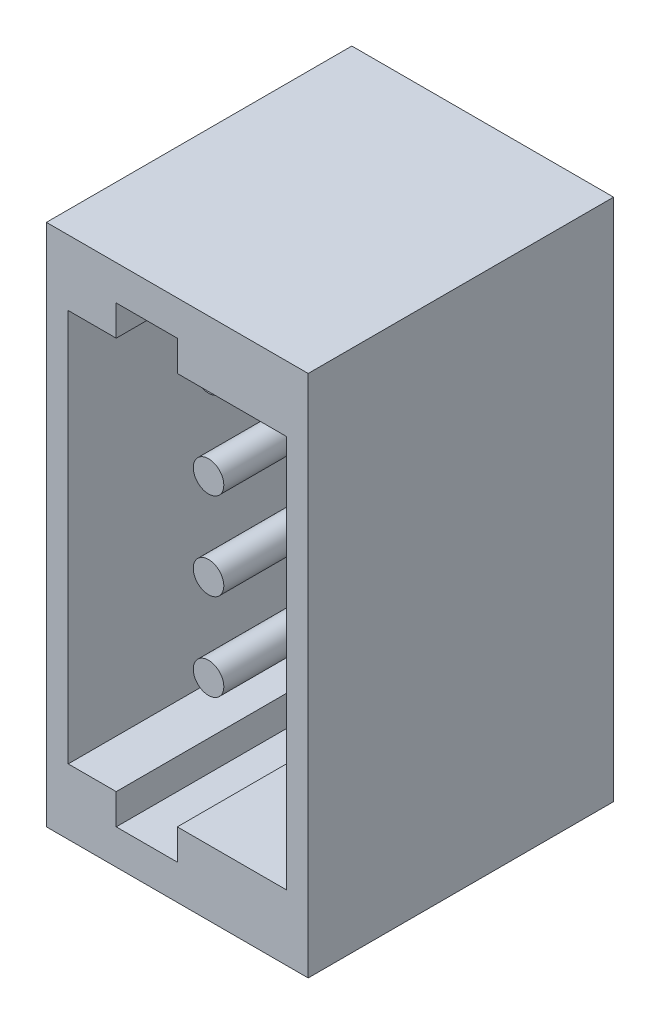
ISO-10303-21;
HEADER;
FILE_DESCRIPTION(('STEP AP214'),'2;1');
FILE_NAME('part.step','',(''),(''),'','','');
FILE_SCHEMA(('AUTOMOTIVE_DESIGN { 1 0 10303 214 1 1 1 1 }'));
ENDSEC;
DATA;
#1=APPLICATION_CONTEXT('core data for automotive mechanical design processes');
#2=APPLICATION_PROTOCOL_DEFINITION('international standard','automotive_design',2000,#1);
#3=PRODUCT_CONTEXT('',#1,'mechanical');
#4=PRODUCT('Part','Part','',(#3));
#5=PRODUCT_RELATED_PRODUCT_CATEGORY('part','',(#4));
#6=PRODUCT_DEFINITION_FORMATION('','',#4);
#7=PRODUCT_DEFINITION_CONTEXT('part definition',#1,'design');
#8=PRODUCT_DEFINITION('design','',#6,#7);
#9=PRODUCT_DEFINITION_SHAPE('','',#8);
#10=(LENGTH_UNIT() NAMED_UNIT(*) SI_UNIT(.MILLI.,.METRE.));
#11=(NAMED_UNIT(*) PLANE_ANGLE_UNIT() SI_UNIT($,.RADIAN.));
#12=(NAMED_UNIT(*) SI_UNIT($,.STERADIAN.) SOLID_ANGLE_UNIT());
#13=UNCERTAINTY_MEASURE_WITH_UNIT(LENGTH_MEASURE(1.E-05),#10,'distance_accuracy_value','');
#14=(GEOMETRIC_REPRESENTATION_CONTEXT(3) GLOBAL_UNCERTAINTY_ASSIGNED_CONTEXT((#13)) GLOBAL_UNIT_ASSIGNED_CONTEXT((#10,
#11,#12)) REPRESENTATION_CONTEXT('',''));
#15=CARTESIAN_POINT('',(0.,0.,0.));
#16=DIRECTION('',(0.,0.,1.));
#17=DIRECTION('',(1.,0.,0.));
#18=AXIS2_PLACEMENT_3D('',#15,#16,#17);
#19=CARTESIAN_POINT('',(95.88560905784,62.82259673516,-10.15));
#20=DIRECTION('',(1.,0.,0.));
#21=DIRECTION('',(0.,0.,-1.));
#22=AXIS2_PLACEMENT_3D('',#19,#20,#21);
#23=PLANE('',#22);
#24=DIRECTION('',(0.,-1.,0.));
#25=VECTOR('',#24,1.);
#26=CARTESIAN_POINT('',(95.88560905784,62.82259673516,-6.65));
#27=LINE('',#26,#25);
#28=CARTESIAN_POINT('',(95.88560905784,62.82259673516,-6.65));
#29=VERTEX_POINT('',#28);
#30=CARTESIAN_POINT('',(95.88560905784,56.82259673516,-6.65));
#31=VERTEX_POINT('',#30);
#32=EDGE_CURVE('E11',#29,#31,#27,.T.);
#33=ORIENTED_EDGE('',*,*,#32,.T.);
#34=DIRECTION('',(0.,0.,-1.));
#35=VECTOR('',#34,1.);
#36=CARTESIAN_POINT('',(95.88560905784,56.82259673516,-6.65));
#37=LINE('',#36,#35);
#38=CARTESIAN_POINT('',(95.88560905784,56.82259673516,-10.15));
#39=VERTEX_POINT('',#38);
#40=EDGE_CURVE('E27',#31,#39,#37,.T.);
#41=ORIENTED_EDGE('',*,*,#40,.T.);
#42=DIRECTION('',(0.,-1.,0.));
#43=VECTOR('',#42,1.);
#44=CARTESIAN_POINT('',(95.88560905784,62.82259673516,-10.15));
#45=LINE('',#44,#43);
#46=CARTESIAN_POINT('',(95.88560905784,62.82259673516,-10.15));
#47=VERTEX_POINT('',#46);
#48=EDGE_CURVE('E492',#47,#39,#45,.T.);
#49=ORIENTED_EDGE('',*,*,#48,.F.);
#50=DIRECTION('',(0.,0.,-1.));
#51=VECTOR('',#50,1.);
#52=CARTESIAN_POINT('',(95.88560905784,62.82259673516,-6.65));
#53=LINE('',#52,#51);
#54=EDGE_CURVE('E560',#29,#47,#53,.T.);
#55=ORIENTED_EDGE('',*,*,#54,.F.);
#56=EDGE_LOOP('',(#33,#41,#49,#55));
#57=FACE_BOUND('',#56,.T.);
#58=ADVANCED_FACE('F17',(#57),#23,.T.);
#59=CARTESIAN_POINT('',(92.88560905784,62.82259673516,-10.15));
#60=DIRECTION('',(0.,1.,0.));
#61=DIRECTION('',(0.,0.,1.));
#62=AXIS2_PLACEMENT_3D('',#59,#60,#61);
#63=PLANE('',#62);
#64=ORIENTED_EDGE('',*,*,#54,.T.);
#65=DIRECTION('',(1.,0.,0.));
#66=VECTOR('',#65,1.);
#67=CARTESIAN_POINT('',(92.88560905784,62.82259673516,-10.15));
#68=LINE('',#67,#66);
#69=CARTESIAN_POINT('',(92.88560905784,62.82259673516,-10.15));
#70=VERTEX_POINT('',#69);
#71=EDGE_CURVE('E489',#70,#47,#68,.T.);
#72=ORIENTED_EDGE('',*,*,#71,.F.);
#73=DIRECTION('',(0.,0.,-1.));
#74=VECTOR('',#73,1.);
#75=CARTESIAN_POINT('',(92.88560905784,62.82259673516,-6.65));
#76=LINE('',#75,#74);
#77=CARTESIAN_POINT('',(92.88560905784,62.82259673516,-6.65));
#78=VERTEX_POINT('',#77);
#79=EDGE_CURVE('E556',#78,#70,#76,.T.);
#80=ORIENTED_EDGE('',*,*,#79,.F.);
#81=DIRECTION('',(1.,0.,0.));
#82=VECTOR('',#81,1.);
#83=CARTESIAN_POINT('',(92.88560905784,62.82259673516,-6.65));
#84=LINE('',#83,#82);
#85=EDGE_CURVE('E555',#78,#29,#84,.T.);
#86=ORIENTED_EDGE('',*,*,#85,.T.);
#87=EDGE_LOOP('',(#64,#72,#80,#86));
#88=FACE_BOUND('',#87,.T.);
#89=ADVANCED_FACE('F201',(#88),#63,.T.);
#90=CARTESIAN_POINT('',(0.,0.,-6.65));
#91=DIRECTION('',(0.,0.,1.));
#92=DIRECTION('',(1.,0.,0.));
#93=AXIS2_PLACEMENT_3D('',#90,#91,#92);
#94=PLANE('',#93);
#95=DIRECTION('',(-1.,0.,0.));
#96=VECTOR('',#95,1.);
#97=CARTESIAN_POINT('',(95.88560905784,56.82259673516,-6.65));
#98=LINE('',#97,#96);
#99=CARTESIAN_POINT('',(92.88560905784,56.82259673516,-6.65));
#100=VERTEX_POINT('',#99);
#101=EDGE_CURVE('E488',#31,#100,#98,.T.);
#102=ORIENTED_EDGE('',*,*,#101,.F.);
#103=ORIENTED_EDGE('',*,*,#32,.F.);
#104=ORIENTED_EDGE('',*,*,#85,.F.);
#105=DIRECTION('',(0.,1.,0.));
#106=VECTOR('',#105,1.);
#107=CARTESIAN_POINT('',(92.88560905784,56.82259673516,-6.65));
#108=LINE('',#107,#106);
#109=EDGE_CURVE('E552',#100,#78,#108,.T.);
#110=ORIENTED_EDGE('',*,*,#109,.F.);
#111=EDGE_LOOP('',(#102,#103,#104,#110));
#112=FACE_BOUND('',#111,.T.);
#113=DIRECTION('',(-1.,0.,0.));
#114=VECTOR('',#113,1.);
#115=CARTESIAN_POINT('',(93.68560905784,62.07259673516,-6.65));
#116=LINE('',#115,#114);
#117=CARTESIAN_POINT('',(93.68560905784,62.07259673516,-6.65));
#118=VERTEX_POINT('',#117);
#119=CARTESIAN_POINT('',(93.13560905784,62.07259673516,-6.65));
#120=VERTEX_POINT('',#119);
#121=EDGE_CURVE('E498',#118,#120,#116,.T.);
#122=ORIENTED_EDGE('',*,*,#121,.F.);
#123=DIRECTION('',(0.,-1.,0.));
#124=VECTOR('',#123,1.);
#125=CARTESIAN_POINT('',(93.68560905784,62.42259673516,-6.65));
#126=LINE('',#125,#124);
#127=CARTESIAN_POINT('',(93.68560905784,62.42259673516,-6.65));
#128=VERTEX_POINT('',#127);
#129=EDGE_CURVE('E504',#128,#118,#126,.T.);
#130=ORIENTED_EDGE('',*,*,#129,.F.);
#131=DIRECTION('',(-1.,0.,0.));
#132=VECTOR('',#131,1.);
#133=CARTESIAN_POINT('',(94.38560905784,62.42259673516,-6.65));
#134=LINE('',#133,#132);
#135=CARTESIAN_POINT('',(94.38560905784,62.42259673516,-6.65));
#136=VERTEX_POINT('',#135);
#137=EDGE_CURVE('E511',#136,#128,#134,.T.);
#138=ORIENTED_EDGE('',*,*,#137,.F.);
#139=DIRECTION('',(0.,1.,0.));
#140=VECTOR('',#139,1.);
#141=CARTESIAN_POINT('',(94.38560905784,62.07259673516,-6.65));
#142=LINE('',#141,#140);
#143=CARTESIAN_POINT('',(94.38560905784,62.07259673516,-6.65));
#144=VERTEX_POINT('',#143);
#145=EDGE_CURVE('E518',#144,#136,#142,.T.);
#146=ORIENTED_EDGE('',*,*,#145,.F.);
#147=DIRECTION('',(-1.,0.,0.));
#148=VECTOR('',#147,1.);
#149=CARTESIAN_POINT('',(95.63560905784,62.07259673516,-6.65));
#150=LINE('',#149,#148);
#151=CARTESIAN_POINT('',(95.63560905784,62.07259673516,-6.65));
#152=VERTEX_POINT('',#151);
#153=EDGE_CURVE('E525',#152,#144,#150,.T.);
#154=ORIENTED_EDGE('',*,*,#153,.F.);
#155=DIRECTION('',(0.,1.,0.));
#156=VECTOR('',#155,1.);
#157=CARTESIAN_POINT('',(95.63560905784,57.57259673516,-6.65));
#158=LINE('',#157,#156);
#159=CARTESIAN_POINT('',(95.63560905784,57.57259673516,-6.65));
#160=VERTEX_POINT('',#159);
#161=EDGE_CURVE('E532',#160,#152,#158,.T.);
#162=ORIENTED_EDGE('',*,*,#161,.F.);
#163=DIRECTION('',(1.,0.,0.));
#164=VECTOR('',#163,1.);
#165=CARTESIAN_POINT('',(94.38560905784,57.57259673516,-6.65));
#166=LINE('',#165,#164);
#167=CARTESIAN_POINT('',(94.38560905784,57.57259673516,-6.65));
#168=VERTEX_POINT('',#167);
#169=EDGE_CURVE('E538',#168,#160,#166,.T.);
#170=ORIENTED_EDGE('',*,*,#169,.F.);
#171=DIRECTION('',(0.,1.,0.));
#172=VECTOR('',#171,1.);
#173=CARTESIAN_POINT('',(94.38560905784,57.22259673516,-6.65));
#174=LINE('',#173,#172);
#175=CARTESIAN_POINT('',(94.38560905784,57.22259673516,-6.65));
#176=VERTEX_POINT('',#175);
#177=EDGE_CURVE('E463',#176,#168,#174,.T.);
#178=ORIENTED_EDGE('',*,*,#177,.F.);
#179=DIRECTION('',(1.,0.,0.));
#180=VECTOR('',#179,1.);
#181=CARTESIAN_POINT('',(93.68560905784,57.22259673516,-6.65));
#182=LINE('',#181,#180);
#183=CARTESIAN_POINT('',(93.68560905784,57.22259673516,-6.65));
#184=VERTEX_POINT('',#183);
#185=EDGE_CURVE('E461',#184,#176,#182,.T.);
#186=ORIENTED_EDGE('',*,*,#185,.F.);
#187=DIRECTION('',(0.,-1.,0.));
#188=VECTOR('',#187,1.);
#189=CARTESIAN_POINT('',(93.68560905784,57.57259673516,-6.65));
#190=LINE('',#189,#188);
#191=CARTESIAN_POINT('',(93.68560905784,57.57259673516,-6.65));
#192=VERTEX_POINT('',#191);
#193=EDGE_CURVE('E147',#192,#184,#190,.T.);
#194=ORIENTED_EDGE('',*,*,#193,.F.);
#195=DIRECTION('',(1.,0.,0.));
#196=VECTOR('',#195,1.);
#197=CARTESIAN_POINT('',(93.13560905784,57.57259673516,-6.65));
#198=LINE('',#197,#196);
#199=CARTESIAN_POINT('',(93.13560905784,57.57259673516,-6.65));
#200=VERTEX_POINT('',#199);
#201=EDGE_CURVE('E145',#200,#192,#198,.T.);
#202=ORIENTED_EDGE('',*,*,#201,.F.);
#203=DIRECTION('',(0.,-1.,0.));
#204=VECTOR('',#203,1.);
#205=CARTESIAN_POINT('',(93.13560905784,62.07259673516,-6.65));
#206=LINE('',#205,#204);
#207=EDGE_CURVE('E476',#120,#200,#206,.T.);
#208=ORIENTED_EDGE('',*,*,#207,.F.);
#209=EDGE_LOOP('',(#122,#130,#138,#146,#154,#162,#170,#178,#186,#194,#202,#208));
#210=FACE_BOUND('',#209,.T.);
#211=ADVANCED_FACE('F207',(#112,#210),#94,.T.);
#212=CARTESIAN_POINT('',(92.88560905784,56.82259673516,-10.15));
#213=DIRECTION('',(-1.,0.,0.));
#214=DIRECTION('',(0.,0.,1.));
#215=AXIS2_PLACEMENT_3D('',#212,#213,#214);
#216=PLANE('',#215);
#217=ORIENTED_EDGE('',*,*,#109,.T.);
#218=ORIENTED_EDGE('',*,*,#79,.T.);
#219=DIRECTION('',(0.,1.,0.));
#220=VECTOR('',#219,1.);
#221=CARTESIAN_POINT('',(92.88560905784,56.82259673516,-10.15));
#222=LINE('',#221,#220);
#223=CARTESIAN_POINT('',(92.88560905784,56.82259673516,-10.15));
#224=VERTEX_POINT('',#223);
#225=EDGE_CURVE('E481',#224,#70,#222,.T.);
#226=ORIENTED_EDGE('',*,*,#225,.F.);
#227=DIRECTION('',(0.,0.,-1.));
#228=VECTOR('',#227,1.);
#229=CARTESIAN_POINT('',(92.88560905784,56.82259673516,-6.65));
#230=LINE('',#229,#228);
#231=EDGE_CURVE('E485',#100,#224,#230,.T.);
#232=ORIENTED_EDGE('',*,*,#231,.F.);
#233=EDGE_LOOP('',(#217,#218,#226,#232));
#234=FACE_BOUND('',#233,.T.);
#235=ADVANCED_FACE('F213',(#234),#216,.T.);
#236=CARTESIAN_POINT('',(95.88560905784,56.82259673516,-10.15));
#237=DIRECTION('',(0.,-1.,0.));
#238=DIRECTION('',(0.,0.,-1.));
#239=AXIS2_PLACEMENT_3D('',#236,#237,#238);
#240=PLANE('',#239);
#241=ORIENTED_EDGE('',*,*,#101,.T.);
#242=ORIENTED_EDGE('',*,*,#231,.T.);
#243=DIRECTION('',(-1.,0.,0.));
#244=VECTOR('',#243,1.);
#245=CARTESIAN_POINT('',(95.88560905784,56.82259673516,-10.15));
#246=LINE('',#245,#244);
#247=EDGE_CURVE('E484',#39,#224,#246,.T.);
#248=ORIENTED_EDGE('',*,*,#247,.F.);
#249=ORIENTED_EDGE('',*,*,#40,.F.);
#250=EDGE_LOOP('',(#241,#242,#248,#249));
#251=FACE_BOUND('',#250,.T.);
#252=ADVANCED_FACE('F217',(#251),#240,.T.);
#253=CARTESIAN_POINT('',(0.,0.,-10.15));
#254=DIRECTION('',(0.,0.,1.));
#255=DIRECTION('',(1.,0.,0.));
#256=AXIS2_PLACEMENT_3D('',#253,#254,#255);
#257=PLANE('',#256);
#258=ORIENTED_EDGE('',*,*,#71,.T.);
#259=ORIENTED_EDGE('',*,*,#48,.T.);
#260=ORIENTED_EDGE('',*,*,#247,.T.);
#261=ORIENTED_EDGE('',*,*,#225,.T.);
#262=EDGE_LOOP('',(#258,#259,#260,#261));
#263=FACE_BOUND('',#262,.T.);
#264=ADVANCED_FACE('F221',(#263),#257,.F.);
#265=CARTESIAN_POINT('',(93.13560905784,62.07259673516,-6.65));
#266=DIRECTION('',(-1.,0.,0.));
#267=DIRECTION('',(0.,-1.,0.));
#268=AXIS2_PLACEMENT_3D('',#265,#266,#267);
#269=PLANE('',#268);
#270=DIRECTION('',(0.,0.,-1.));
#271=VECTOR('',#270,1.);
#272=CARTESIAN_POINT('',(93.13560905784,57.57259673516,-6.65));
#273=LINE('',#272,#271);
#274=CARTESIAN_POINT('',(93.13560905784,57.57259673516,-9.45));
#275=VERTEX_POINT('',#274);
#276=EDGE_CURVE('E479',#200,#275,#273,.T.);
#277=ORIENTED_EDGE('',*,*,#276,.T.);
#278=DIRECTION('',(0.,-1.,0.));
#279=VECTOR('',#278,1.);
#280=CARTESIAN_POINT('',(93.13560905784,62.07259673516,-9.45));
#281=LINE('',#280,#279);
#282=CARTESIAN_POINT('',(93.13560905784,62.07259673516,-9.45));
#283=VERTEX_POINT('',#282);
#284=EDGE_CURVE('E152',#283,#275,#281,.T.);
#285=ORIENTED_EDGE('',*,*,#284,.F.);
#286=DIRECTION('',(0.,0.,-1.));
#287=VECTOR('',#286,1.);
#288=CARTESIAN_POINT('',(93.13560905784,62.07259673516,-6.65));
#289=LINE('',#288,#287);
#290=EDGE_CURVE('E480',#120,#283,#289,.T.);
#291=ORIENTED_EDGE('',*,*,#290,.F.);
#292=ORIENTED_EDGE('',*,*,#207,.T.);
#293=EDGE_LOOP('',(#277,#285,#291,#292));
#294=FACE_BOUND('',#293,.T.);
#295=ADVANCED_FACE('F224',(#294),#269,.F.);
#296=CARTESIAN_POINT('',(93.68560905784,62.07259673516,-6.65));
#297=DIRECTION('',(0.,1.,0.));
#298=DIRECTION('',(-1.,0.,0.));
#299=AXIS2_PLACEMENT_3D('',#296,#297,#298);
#300=PLANE('',#299);
#301=ORIENTED_EDGE('',*,*,#290,.T.);
#302=DIRECTION('',(-1.,0.,0.));
#303=VECTOR('',#302,1.);
#304=CARTESIAN_POINT('',(93.68560905784,62.07259673516,-9.45));
#305=LINE('',#304,#303);
#306=CARTESIAN_POINT('',(93.68560905784,62.07259673516,-9.45));
#307=VERTEX_POINT('',#306);
#308=EDGE_CURVE('E495',#307,#283,#305,.T.);
#309=ORIENTED_EDGE('',*,*,#308,.F.);
#310=DIRECTION('',(0.,0.,-1.));
#311=VECTOR('',#310,1.);
#312=CARTESIAN_POINT('',(93.68560905784,62.07259673516,-6.65));
#313=LINE('',#312,#311);
#314=EDGE_CURVE('E501',#118,#307,#313,.T.);
#315=ORIENTED_EDGE('',*,*,#314,.F.);
#316=ORIENTED_EDGE('',*,*,#121,.T.);
#317=EDGE_LOOP('',(#301,#309,#315,#316));
#318=FACE_BOUND('',#317,.T.);
#319=ADVANCED_FACE('F228',(#318),#300,.F.);
#320=CARTESIAN_POINT('',(93.68560905784,62.42259673516,-6.65));
#321=DIRECTION('',(-1.,0.,0.));
#322=DIRECTION('',(0.,-1.,0.));
#323=AXIS2_PLACEMENT_3D('',#320,#321,#322);
#324=PLANE('',#323);
#325=ORIENTED_EDGE('',*,*,#314,.T.);
#326=DIRECTION('',(0.,-1.,0.));
#327=VECTOR('',#326,1.);
#328=CARTESIAN_POINT('',(93.68560905784,62.42259673516,-9.45));
#329=LINE('',#328,#327);
#330=CARTESIAN_POINT('',(93.68560905784,62.42259673516,-9.45));
#331=VERTEX_POINT('',#330);
#332=EDGE_CURVE('E500',#331,#307,#329,.T.);
#333=ORIENTED_EDGE('',*,*,#332,.F.);
#334=DIRECTION('',(0.,0.,-1.));
#335=VECTOR('',#334,1.);
#336=CARTESIAN_POINT('',(93.68560905784,62.42259673516,-6.65));
#337=LINE('',#336,#335);
#338=EDGE_CURVE('E508',#128,#331,#337,.T.);
#339=ORIENTED_EDGE('',*,*,#338,.F.);
#340=ORIENTED_EDGE('',*,*,#129,.T.);
#341=EDGE_LOOP('',(#325,#333,#339,#340));
#342=FACE_BOUND('',#341,.T.);
#343=ADVANCED_FACE('F232',(#342),#324,.F.);
#344=CARTESIAN_POINT('',(94.38560905784,62.42259673516,-6.65));
#345=DIRECTION('',(0.,1.,0.));
#346=DIRECTION('',(-1.,0.,0.));
#347=AXIS2_PLACEMENT_3D('',#344,#345,#346);
#348=PLANE('',#347);
#349=ORIENTED_EDGE('',*,*,#338,.T.);
#350=DIRECTION('',(-1.,0.,0.));
#351=VECTOR('',#350,1.);
#352=CARTESIAN_POINT('',(94.38560905784,62.42259673516,-9.45));
#353=LINE('',#352,#351);
#354=CARTESIAN_POINT('',(94.38560905784,62.42259673516,-9.45));
#355=VERTEX_POINT('',#354);
#356=EDGE_CURVE('E507',#355,#331,#353,.T.);
#357=ORIENTED_EDGE('',*,*,#356,.F.);
#358=DIRECTION('',(0.,0.,-1.));
#359=VECTOR('',#358,1.);
#360=CARTESIAN_POINT('',(94.38560905784,62.42259673516,-6.65));
#361=LINE('',#360,#359);
#362=EDGE_CURVE('E515',#136,#355,#361,.T.);
#363=ORIENTED_EDGE('',*,*,#362,.F.);
#364=ORIENTED_EDGE('',*,*,#137,.T.);
#365=EDGE_LOOP('',(#349,#357,#363,#364));
#366=FACE_BOUND('',#365,.T.);
#367=ADVANCED_FACE('F236',(#366),#348,.F.);
#368=CARTESIAN_POINT('',(94.38560905784,62.07259673516,-6.65));
#369=DIRECTION('',(1.,0.,0.));
#370=DIRECTION('',(0.,1.,0.));
#371=AXIS2_PLACEMENT_3D('',#368,#369,#370);
#372=PLANE('',#371);
#373=ORIENTED_EDGE('',*,*,#362,.T.);
#374=DIRECTION('',(0.,1.,0.));
#375=VECTOR('',#374,1.);
#376=CARTESIAN_POINT('',(94.38560905784,62.07259673516,-9.45));
#377=LINE('',#376,#375);
#378=CARTESIAN_POINT('',(94.38560905784,62.07259673516,-9.45));
#379=VERTEX_POINT('',#378);
#380=EDGE_CURVE('E514',#379,#355,#377,.T.);
#381=ORIENTED_EDGE('',*,*,#380,.F.);
#382=DIRECTION('',(0.,0.,-1.));
#383=VECTOR('',#382,1.);
#384=CARTESIAN_POINT('',(94.38560905784,62.07259673516,-6.65));
#385=LINE('',#384,#383);
#386=EDGE_CURVE('E522',#144,#379,#385,.T.);
#387=ORIENTED_EDGE('',*,*,#386,.F.);
#388=ORIENTED_EDGE('',*,*,#145,.T.);
#389=EDGE_LOOP('',(#373,#381,#387,#388));
#390=FACE_BOUND('',#389,.T.);
#391=ADVANCED_FACE('F240',(#390),#372,.F.);
#392=CARTESIAN_POINT('',(95.63560905784,62.07259673516,-6.65));
#393=DIRECTION('',(0.,1.,0.));
#394=DIRECTION('',(-1.,0.,0.));
#395=AXIS2_PLACEMENT_3D('',#392,#393,#394);
#396=PLANE('',#395);
#397=ORIENTED_EDGE('',*,*,#386,.T.);
#398=DIRECTION('',(-1.,0.,0.));
#399=VECTOR('',#398,1.);
#400=CARTESIAN_POINT('',(95.63560905784,62.07259673516,-9.45));
#401=LINE('',#400,#399);
#402=CARTESIAN_POINT('',(95.63560905784,62.07259673516,-9.45));
#403=VERTEX_POINT('',#402);
#404=EDGE_CURVE('E521',#403,#379,#401,.T.);
#405=ORIENTED_EDGE('',*,*,#404,.F.);
#406=DIRECTION('',(0.,0.,-1.));
#407=VECTOR('',#406,1.);
#408=CARTESIAN_POINT('',(95.63560905784,62.07259673516,-6.65));
#409=LINE('',#408,#407);
#410=EDGE_CURVE('E529',#152,#403,#409,.T.);
#411=ORIENTED_EDGE('',*,*,#410,.F.);
#412=ORIENTED_EDGE('',*,*,#153,.T.);
#413=EDGE_LOOP('',(#397,#405,#411,#412));
#414=FACE_BOUND('',#413,.T.);
#415=ADVANCED_FACE('F244',(#414),#396,.F.);
#416=CARTESIAN_POINT('',(95.63560905784,57.57259673516,-6.65));
#417=DIRECTION('',(1.,0.,0.));
#418=DIRECTION('',(0.,1.,0.));
#419=AXIS2_PLACEMENT_3D('',#416,#417,#418);
#420=PLANE('',#419);
#421=ORIENTED_EDGE('',*,*,#410,.T.);
#422=DIRECTION('',(0.,1.,0.));
#423=VECTOR('',#422,1.);
#424=CARTESIAN_POINT('',(95.63560905784,57.57259673516,-9.45));
#425=LINE('',#424,#423);
#426=CARTESIAN_POINT('',(95.63560905784,57.57259673516,-9.45));
#427=VERTEX_POINT('',#426);
#428=EDGE_CURVE('E528',#427,#403,#425,.T.);
#429=ORIENTED_EDGE('',*,*,#428,.F.);
#430=DIRECTION('',(0.,0.,-1.));
#431=VECTOR('',#430,1.);
#432=CARTESIAN_POINT('',(95.63560905784,57.57259673516,-6.65));
#433=LINE('',#432,#431);
#434=EDGE_CURVE('E535',#160,#427,#433,.T.);
#435=ORIENTED_EDGE('',*,*,#434,.F.);
#436=ORIENTED_EDGE('',*,*,#161,.T.);
#437=EDGE_LOOP('',(#421,#429,#435,#436));
#438=FACE_BOUND('',#437,.T.);
#439=ADVANCED_FACE('F248',(#438),#420,.F.);
#440=CARTESIAN_POINT('',(94.38560905784,57.57259673516,-6.65));
#441=DIRECTION('',(0.,-1.,0.));
#442=DIRECTION('',(1.,0.,0.));
#443=AXIS2_PLACEMENT_3D('',#440,#441,#442);
#444=PLANE('',#443);
#445=ORIENTED_EDGE('',*,*,#434,.T.);
#446=DIRECTION('',(1.,0.,0.));
#447=VECTOR('',#446,1.);
#448=CARTESIAN_POINT('',(94.38560905784,57.57259673516,-9.45));
#449=LINE('',#448,#447);
#450=CARTESIAN_POINT('',(94.38560905784,57.57259673516,-9.45));
#451=VERTEX_POINT('',#450);
#452=EDGE_CURVE('E469',#451,#427,#449,.T.);
#453=ORIENTED_EDGE('',*,*,#452,.F.);
#454=DIRECTION('',(0.,0.,-1.));
#455=VECTOR('',#454,1.);
#456=CARTESIAN_POINT('',(94.38560905784,57.57259673516,-6.65));
#457=LINE('',#456,#455);
#458=EDGE_CURVE('E540',#168,#451,#457,.T.);
#459=ORIENTED_EDGE('',*,*,#458,.F.);
#460=ORIENTED_EDGE('',*,*,#169,.T.);
#461=EDGE_LOOP('',(#445,#453,#459,#460));
#462=FACE_BOUND('',#461,.T.);
#463=ADVANCED_FACE('F252',(#462),#444,.F.);
#464=CARTESIAN_POINT('',(94.38560905784,57.22259673516,-6.65));
#465=DIRECTION('',(1.,0.,0.));
#466=DIRECTION('',(0.,1.,0.));
#467=AXIS2_PLACEMENT_3D('',#464,#465,#466);
#468=PLANE('',#467);
#469=ORIENTED_EDGE('',*,*,#458,.T.);
#470=DIRECTION('',(0.,1.,0.));
#471=VECTOR('',#470,1.);
#472=CARTESIAN_POINT('',(94.38560905784,57.22259673516,-9.45));
#473=LINE('',#472,#471);
#474=CARTESIAN_POINT('',(94.38560905784,57.22259673516,-9.45));
#475=VERTEX_POINT('',#474);
#476=EDGE_CURVE('E467',#475,#451,#473,.T.);
#477=ORIENTED_EDGE('',*,*,#476,.F.);
#478=DIRECTION('',(0.,0.,-1.));
#479=VECTOR('',#478,1.);
#480=CARTESIAN_POINT('',(94.38560905784,57.22259673516,-6.65));
#481=LINE('',#480,#479);
#482=EDGE_CURVE('E459',#176,#475,#481,.T.);
#483=ORIENTED_EDGE('',*,*,#482,.F.);
#484=ORIENTED_EDGE('',*,*,#177,.T.);
#485=EDGE_LOOP('',(#469,#477,#483,#484));
#486=FACE_BOUND('',#485,.T.);
#487=ADVANCED_FACE('F256',(#486),#468,.F.);
#488=CARTESIAN_POINT('',(93.68560905784,57.22259673516,-6.65));
#489=DIRECTION('',(0.,-1.,0.));
#490=DIRECTION('',(1.,0.,0.));
#491=AXIS2_PLACEMENT_3D('',#488,#489,#490);
#492=PLANE('',#491);
#493=ORIENTED_EDGE('',*,*,#482,.T.);
#494=DIRECTION('',(1.,0.,0.));
#495=VECTOR('',#494,1.);
#496=CARTESIAN_POINT('',(93.68560905784,57.22259673516,-9.45));
#497=LINE('',#496,#495);
#498=CARTESIAN_POINT('',(93.68560905784,57.22259673516,-9.45));
#499=VERTEX_POINT('',#498);
#500=EDGE_CURVE('E126',#499,#475,#497,.T.);
#501=ORIENTED_EDGE('',*,*,#500,.F.);
#502=DIRECTION('',(0.,0.,-1.));
#503=VECTOR('',#502,1.);
#504=CARTESIAN_POINT('',(93.68560905784,57.22259673516,-6.65));
#505=LINE('',#504,#503);
#506=EDGE_CURVE('E136',#184,#499,#505,.T.);
#507=ORIENTED_EDGE('',*,*,#506,.F.);
#508=ORIENTED_EDGE('',*,*,#185,.T.);
#509=EDGE_LOOP('',(#493,#501,#507,#508));
#510=FACE_BOUND('',#509,.T.);
#511=ADVANCED_FACE('F260',(#510),#492,.F.);
#512=CARTESIAN_POINT('',(93.68560905784,57.57259673516,-6.65));
#513=DIRECTION('',(-1.,0.,0.));
#514=DIRECTION('',(0.,-1.,0.));
#515=AXIS2_PLACEMENT_3D('',#512,#513,#514);
#516=PLANE('',#515);
#517=ORIENTED_EDGE('',*,*,#506,.T.);
#518=DIRECTION('',(0.,-1.,0.));
#519=VECTOR('',#518,1.);
#520=CARTESIAN_POINT('',(93.68560905784,57.57259673516,-9.45));
#521=LINE('',#520,#519);
#522=CARTESIAN_POINT('',(93.68560905784,57.57259673516,-9.45));
#523=VERTEX_POINT('',#522);
#524=EDGE_CURVE('E132',#523,#499,#521,.T.);
#525=ORIENTED_EDGE('',*,*,#524,.F.);
#526=DIRECTION('',(0.,0.,-1.));
#527=VECTOR('',#526,1.);
#528=CARTESIAN_POINT('',(93.68560905784,57.57259673516,-6.65));
#529=LINE('',#528,#527);
#530=EDGE_CURVE('E135',#192,#523,#529,.T.);
#531=ORIENTED_EDGE('',*,*,#530,.F.);
#532=ORIENTED_EDGE('',*,*,#193,.T.);
#533=EDGE_LOOP('',(#517,#525,#531,#532));
#534=FACE_BOUND('',#533,.T.);
#535=ADVANCED_FACE('F134',(#534),#516,.F.);
#536=CARTESIAN_POINT('',(93.13560905784,57.57259673516,-6.65));
#537=DIRECTION('',(0.,-1.,0.));
#538=DIRECTION('',(1.,0.,0.));
#539=AXIS2_PLACEMENT_3D('',#536,#537,#538);
#540=PLANE('',#539);
#541=ORIENTED_EDGE('',*,*,#530,.T.);
#542=DIRECTION('',(1.,0.,0.));
#543=VECTOR('',#542,1.);
#544=CARTESIAN_POINT('',(93.13560905784,57.57259673516,-9.45));
#545=LINE('',#544,#543);
#546=EDGE_CURVE('E139',#275,#523,#545,.T.);
#547=ORIENTED_EDGE('',*,*,#546,.F.);
#548=ORIENTED_EDGE('',*,*,#276,.F.);
#549=ORIENTED_EDGE('',*,*,#201,.T.);
#550=EDGE_LOOP('',(#541,#547,#548,#549));
#551=FACE_BOUND('',#550,.T.);
#552=ADVANCED_FACE('F143',(#551),#540,.F.);
#553=CARTESIAN_POINT('',(0.,0.,-9.45));
#554=DIRECTION('',(0.,0.,1.));
#555=DIRECTION('',(1.,0.,0.));
#556=AXIS2_PLACEMENT_3D('',#553,#554,#555);
#557=PLANE('',#556);
#558=ORIENTED_EDGE('',*,*,#546,.T.);
#559=ORIENTED_EDGE('',*,*,#524,.T.);
#560=ORIENTED_EDGE('',*,*,#500,.T.);
#561=ORIENTED_EDGE('',*,*,#476,.T.);
#562=ORIENTED_EDGE('',*,*,#452,.T.);
#563=ORIENTED_EDGE('',*,*,#428,.T.);
#564=ORIENTED_EDGE('',*,*,#404,.T.);
#565=ORIENTED_EDGE('',*,*,#380,.T.);
#566=ORIENTED_EDGE('',*,*,#356,.T.);
#567=ORIENTED_EDGE('',*,*,#332,.T.);
#568=ORIENTED_EDGE('',*,*,#308,.T.);
#569=ORIENTED_EDGE('',*,*,#284,.T.);
#570=EDGE_LOOP('',(#558,#559,#560,#561,#562,#563,#564,#565,#566,#567,#568,#569));
#571=FACE_BOUND('',#570,.T.);
#572=CARTESIAN_POINT('',(93.83560905784,60.32259673516,-9.45));
#573=DIRECTION('',(0.,0.,1.));
#574=DIRECTION('',(-1.,0.,0.));
#575=AXIS2_PLACEMENT_3D('',#572,#573,#574);
#576=CIRCLE('',#575,0.175);
#577=CARTESIAN_POINT('',(93.66060905784,60.32259673516,-9.45));
#578=VERTEX_POINT('',#577);
#579=EDGE_CURVE('E157',#578,#578,#576,.T.);
#580=ORIENTED_EDGE('',*,*,#579,.F.);
#581=EDGE_LOOP('',(#580));
#582=FACE_BOUND('',#581,.T.);
#583=CARTESIAN_POINT('',(93.83560905784,59.32259673516,-9.45));
#584=DIRECTION('',(0.,0.,1.));
#585=DIRECTION('',(-1.,0.,0.));
#586=AXIS2_PLACEMENT_3D('',#583,#584,#585);
#587=CIRCLE('',#586,0.175);
#588=CARTESIAN_POINT('',(93.66060905784,59.32259673516,-9.45));
#589=VERTEX_POINT('',#588);
#590=EDGE_CURVE('E161',#589,#589,#587,.T.);
#591=ORIENTED_EDGE('',*,*,#590,.F.);
#592=EDGE_LOOP('',(#591));
#593=FACE_BOUND('',#592,.T.);
#594=CARTESIAN_POINT('',(93.83560905784,61.32259673516,-9.45));
#595=DIRECTION('',(0.,0.,1.));
#596=DIRECTION('',(-1.,0.,0.));
#597=AXIS2_PLACEMENT_3D('',#594,#595,#596);
#598=CIRCLE('',#597,0.175);
#599=CARTESIAN_POINT('',(93.66060905784,61.32259673516,-9.45));
#600=VERTEX_POINT('',#599);
#601=EDGE_CURVE('E164',#600,#600,#598,.T.);
#602=ORIENTED_EDGE('',*,*,#601,.F.);
#603=EDGE_LOOP('',(#602));
#604=FACE_BOUND('',#603,.T.);
#605=CARTESIAN_POINT('',(93.83560905784,58.32259673516,-9.45));
#606=DIRECTION('',(0.,0.,1.));
#607=DIRECTION('',(-1.,0.,0.));
#608=AXIS2_PLACEMENT_3D('',#605,#606,#607);
#609=CIRCLE('',#608,0.175);
#610=CARTESIAN_POINT('',(93.66060905784,58.32259673516,-9.45));
#611=VERTEX_POINT('',#610);
#612=EDGE_CURVE('E167',#611,#611,#609,.T.);
#613=ORIENTED_EDGE('',*,*,#612,.F.);
#614=EDGE_LOOP('',(#613));
#615=FACE_BOUND('',#614,.T.);
#616=ADVANCED_FACE('F149',(#571,#582,#593,#604,#615),#557,.T.);
#617=CARTESIAN_POINT('',(93.83560905784,60.32259673516,-9.45));
#618=DIRECTION('',(0.,0.,1.));
#619=DIRECTION('',(1.,0.,0.));
#620=AXIS2_PLACEMENT_3D('',#617,#618,#619);
#621=CYLINDRICAL_SURFACE('',#620,0.175);
#622=CARTESIAN_POINT('',(93.83560905784,60.32259673516,-7.558));
#623=DIRECTION('',(0.,0.,1.));
#624=DIRECTION('',(1.,0.,0.));
#625=AXIS2_PLACEMENT_3D('',#622,#623,#624);
#626=CIRCLE('',#625,0.175);
#627=CARTESIAN_POINT('',(94.01060905784,60.32259673516,-7.558));
#628=VERTEX_POINT('',#627);
#629=EDGE_CURVE('E160',#628,#628,#626,.T.);
#630=ORIENTED_EDGE('',*,*,#629,.F.);
#631=EDGE_LOOP('',(#630));
#632=FACE_BOUND('',#631,.T.);
#633=ORIENTED_EDGE('',*,*,#579,.T.);
#634=EDGE_LOOP('',(#633));
#635=FACE_BOUND('',#634,.T.);
#636=ADVANCED_FACE('F189',(#632,#635),#621,.T.);
#637=CARTESIAN_POINT('',(0.,0.,-7.558));
#638=DIRECTION('',(0.,0.,1.));
#639=DIRECTION('',(1.,0.,0.));
#640=AXIS2_PLACEMENT_3D('',#637,#638,#639);
#641=PLANE('',#640);
#642=ORIENTED_EDGE('',*,*,#629,.T.);
#643=EDGE_LOOP('',(#642));
#644=FACE_BOUND('',#643,.T.);
#645=ADVANCED_FACE('F196',(#644),#641,.T.);
#646=CARTESIAN_POINT('',(0.,0.,-7.558));
#647=DIRECTION('',(0.,0.,1.));
#648=DIRECTION('',(1.,0.,0.));
#649=AXIS2_PLACEMENT_3D('',#646,#647,#648);
#650=PLANE('',#649);
#651=CARTESIAN_POINT('',(93.83560905784,59.32259673516,-7.558));
#652=DIRECTION('',(0.,0.,1.));
#653=DIRECTION('',(-1.,0.,0.));
#654=AXIS2_PLACEMENT_3D('',#651,#652,#653);
#655=CIRCLE('',#654,0.175);
#656=CARTESIAN_POINT('',(93.66060905784,59.32259673516,-7.558));
#657=VERTEX_POINT('',#656);
#658=EDGE_CURVE('E172',#657,#657,#655,.T.);
#659=ORIENTED_EDGE('',*,*,#658,.T.);
#660=EDGE_LOOP('',(#659));
#661=FACE_BOUND('',#660,.T.);
#662=ADVANCED_FACE('F297',(#661),#650,.T.);
#663=CARTESIAN_POINT('',(0.,0.,-7.558));
#664=DIRECTION('',(0.,0.,1.));
#665=DIRECTION('',(1.,0.,0.));
#666=AXIS2_PLACEMENT_3D('',#663,#664,#665);
#667=PLANE('',#666);
#668=CARTESIAN_POINT('',(93.83560905784,61.32259673516,-7.558));
#669=DIRECTION('',(0.,0.,1.));
#670=DIRECTION('',(-1.,0.,0.));
#671=AXIS2_PLACEMENT_3D('',#668,#669,#670);
#672=CIRCLE('',#671,0.175);
#673=CARTESIAN_POINT('',(93.66060905784,61.32259673516,-7.558));
#674=VERTEX_POINT('',#673);
#675=EDGE_CURVE('E174',#674,#674,#672,.T.);
#676=ORIENTED_EDGE('',*,*,#675,.T.);
#677=EDGE_LOOP('',(#676));
#678=FACE_BOUND('',#677,.T.);
#679=ADVANCED_FACE('F307',(#678),#667,.T.);
#680=CARTESIAN_POINT('',(0.,0.,-7.558));
#681=DIRECTION('',(0.,0.,1.));
#682=DIRECTION('',(1.,0.,0.));
#683=AXIS2_PLACEMENT_3D('',#680,#681,#682);
#684=PLANE('',#683);
#685=CARTESIAN_POINT('',(93.83560905784,58.32259673516,-7.558));
#686=DIRECTION('',(0.,0.,1.));
#687=DIRECTION('',(-1.,0.,0.));
#688=AXIS2_PLACEMENT_3D('',#685,#686,#687);
#689=CIRCLE('',#688,0.175);
#690=CARTESIAN_POINT('',(93.66060905784,58.32259673516,-7.558));
#691=VERTEX_POINT('',#690);
#692=EDGE_CURVE('E21',#691,#691,#689,.T.);
#693=ORIENTED_EDGE('',*,*,#692,.T.);
#694=EDGE_LOOP('',(#693));
#695=FACE_BOUND('',#694,.T.);
#696=ADVANCED_FACE('F181',(#695),#684,.T.);
#697=CARTESIAN_POINT('',(93.83560905784,59.32259673516,-9.45));
#698=DIRECTION('',(0.,0.,1.));
#699=DIRECTION('',(1.,0.,0.));
#700=AXIS2_PLACEMENT_3D('',#697,#698,#699);
#701=CYLINDRICAL_SURFACE('',#700,0.175);
#702=ORIENTED_EDGE('',*,*,#658,.F.);
#703=EDGE_LOOP('',(#702));
#704=FACE_BOUND('',#703,.T.);
#705=ORIENTED_EDGE('',*,*,#590,.T.);
#706=EDGE_LOOP('',(#705));
#707=FACE_BOUND('',#706,.T.);
#708=ADVANCED_FACE('F325',(#704,#707),#701,.T.);
#709=CARTESIAN_POINT('',(93.83560905784,61.32259673516,-9.45));
#710=DIRECTION('',(0.,0.,1.));
#711=DIRECTION('',(1.,0.,0.));
#712=AXIS2_PLACEMENT_3D('',#709,#710,#711);
#713=CYLINDRICAL_SURFACE('',#712,0.175);
#714=ORIENTED_EDGE('',*,*,#675,.F.);
#715=EDGE_LOOP('',(#714));
#716=FACE_BOUND('',#715,.T.);
#717=ORIENTED_EDGE('',*,*,#601,.T.);
#718=EDGE_LOOP('',(#717));
#719=FACE_BOUND('',#718,.T.);
#720=ADVANCED_FACE('F185',(#716,#719),#713,.T.);
#721=CARTESIAN_POINT('',(93.83560905784,58.32259673516,-9.45));
#722=DIRECTION('',(0.,0.,1.));
#723=DIRECTION('',(1.,0.,0.));
#724=AXIS2_PLACEMENT_3D('',#721,#722,#723);
#725=CYLINDRICAL_SURFACE('',#724,0.175);
#726=ORIENTED_EDGE('',*,*,#692,.F.);
#727=EDGE_LOOP('',(#726));
#728=FACE_BOUND('',#727,.T.);
#729=ORIENTED_EDGE('',*,*,#612,.T.);
#730=EDGE_LOOP('',(#729));
#731=FACE_BOUND('',#730,.T.);
#732=ADVANCED_FACE('F19',(#728,#731),#725,.T.);
#733=CLOSED_SHELL('',(#58,#89,#211,#235,#252,#264,#295,#319,#343,#367,#391,#415,#439,#463,#487,
#511,#535,#552,#616,#636,#645,#662,#679,#696,#708,#720,#732));
#734=MANIFOLD_SOLID_BREP('B1',#733);
#735=ADVANCED_BREP_SHAPE_REPRESENTATION('',(#18,#734),#14);
#736=SHAPE_DEFINITION_REPRESENTATION(#9,#735);
ENDSEC;
END-ISO-10303-21;
